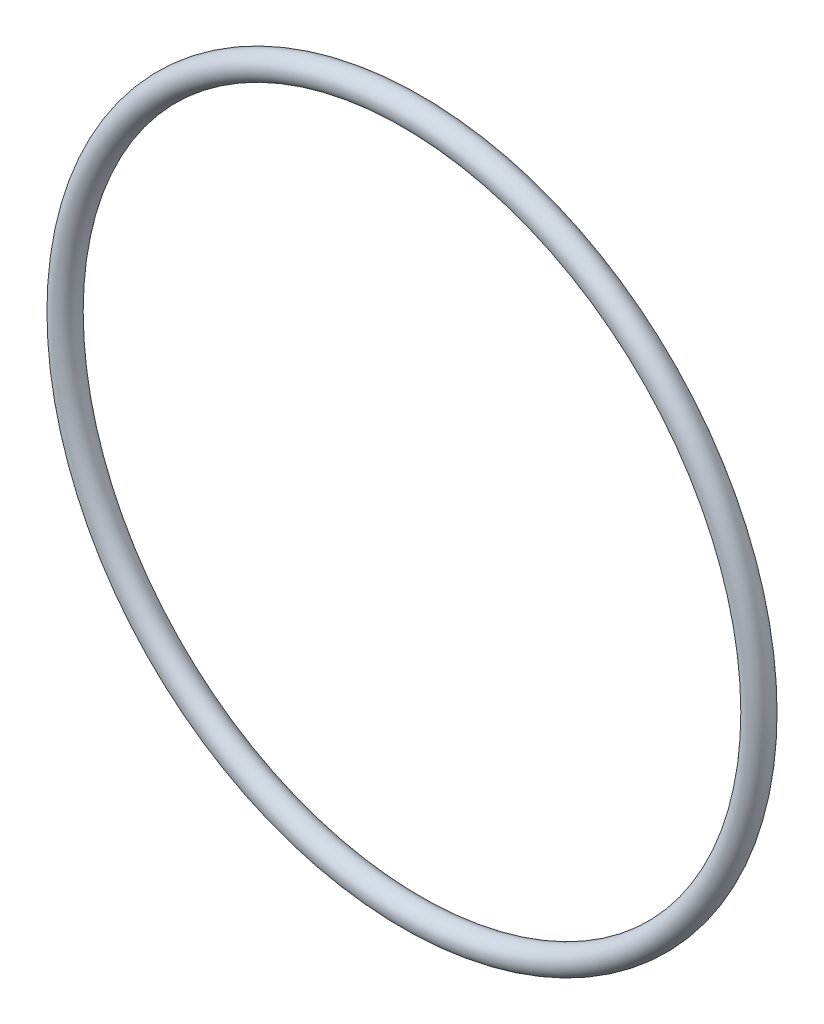
ISO-10303-21;
HEADER;
FILE_DESCRIPTION(('STEP AP214'),'2;1');
FILE_NAME('part.step','',(''),(''),'','','');
FILE_SCHEMA(('AUTOMOTIVE_DESIGN { 1 0 10303 214 1 1 1 1 }'));
ENDSEC;
DATA;
#1=APPLICATION_CONTEXT('core data for automotive mechanical design processes');
#2=APPLICATION_PROTOCOL_DEFINITION('international standard','automotive_design',2000,#1);
#3=PRODUCT_CONTEXT('',#1,'mechanical');
#4=PRODUCT('Part','Part','',(#3));
#5=PRODUCT_RELATED_PRODUCT_CATEGORY('part','',(#4));
#6=PRODUCT_DEFINITION_FORMATION('','',#4);
#7=PRODUCT_DEFINITION_CONTEXT('part definition',#1,'design');
#8=PRODUCT_DEFINITION('design','',#6,#7);
#9=PRODUCT_DEFINITION_SHAPE('','',#8);
#10=(LENGTH_UNIT() NAMED_UNIT(*) SI_UNIT(.MILLI.,.METRE.));
#11=(NAMED_UNIT(*) PLANE_ANGLE_UNIT() SI_UNIT($,.RADIAN.));
#12=(NAMED_UNIT(*) SI_UNIT($,.STERADIAN.) SOLID_ANGLE_UNIT());
#13=UNCERTAINTY_MEASURE_WITH_UNIT(LENGTH_MEASURE(1.E-05),#10,'distance_accuracy_value','');
#14=(GEOMETRIC_REPRESENTATION_CONTEXT(3) GLOBAL_UNCERTAINTY_ASSIGNED_CONTEXT((#13)) GLOBAL_UNIT_ASSIGNED_CONTEXT((#10,
#11,#12)) REPRESENTATION_CONTEXT('',''));
#15=CARTESIAN_POINT('',(0.,0.,0.));
#16=DIRECTION('',(0.,0.,1.));
#17=DIRECTION('',(1.,0.,0.));
#18=AXIS2_PLACEMENT_3D('',#15,#16,#17);
#19=CARTESIAN_POINT('',(0.,0.,0.));
#20=DIRECTION('',(0.,0.,-1.));
#21=DIRECTION('',(-1.,0.,0.));
#22=AXIS2_PLACEMENT_3D('',#19,#20,#21);
#23=TOROIDAL_SURFACE('',#22,48.025,1.775);
#24=CARTESIAN_POINT('',(-49.8,0.,0.));
#25=VERTEX_POINT('',#24);
#26=VERTEX_LOOP('',#25);
#27=FACE_BOUND('',#26,.T.);
#28=ADVANCED_FACE('F29',(#27),#23,.T.);
#29=CLOSED_SHELL('',(#28));
#30=MANIFOLD_SOLID_BREP('B2',#29);
#31=ADVANCED_BREP_SHAPE_REPRESENTATION('',(#18,#30),#14);
#32=SHAPE_DEFINITION_REPRESENTATION(#9,#31);
ENDSEC;
END-ISO-10303-21;
